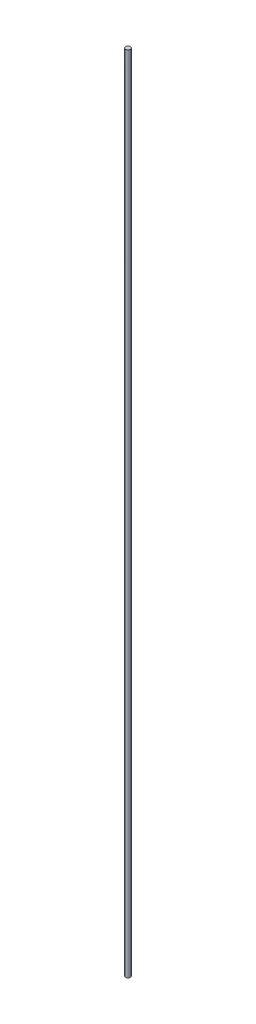
ISO-10303-21;
HEADER;
FILE_DESCRIPTION(('STEP AP214'),'2;1');
FILE_NAME('part.step','',(''),(''),'','','');
FILE_SCHEMA(('AUTOMOTIVE_DESIGN { 1 0 10303 214 1 1 1 1 }'));
ENDSEC;
DATA;
#1=APPLICATION_CONTEXT('core data for automotive mechanical design processes');
#2=APPLICATION_PROTOCOL_DEFINITION('international standard','automotive_design',2000,#1);
#3=PRODUCT_CONTEXT('',#1,'mechanical');
#4=PRODUCT('Part','Part','',(#3));
#5=PRODUCT_RELATED_PRODUCT_CATEGORY('part','',(#4));
#6=PRODUCT_DEFINITION_FORMATION('','',#4);
#7=PRODUCT_DEFINITION_CONTEXT('part definition',#1,'design');
#8=PRODUCT_DEFINITION('design','',#6,#7);
#9=PRODUCT_DEFINITION_SHAPE('','',#8);
#10=(LENGTH_UNIT() NAMED_UNIT(*) SI_UNIT(.MILLI.,.METRE.));
#11=(NAMED_UNIT(*) PLANE_ANGLE_UNIT() SI_UNIT($,.RADIAN.));
#12=(NAMED_UNIT(*) SI_UNIT($,.STERADIAN.) SOLID_ANGLE_UNIT());
#13=UNCERTAINTY_MEASURE_WITH_UNIT(LENGTH_MEASURE(1.E-05),#10,'distance_accuracy_value','');
#14=(GEOMETRIC_REPRESENTATION_CONTEXT(3) GLOBAL_UNCERTAINTY_ASSIGNED_CONTEXT((#13)) GLOBAL_UNIT_ASSIGNED_CONTEXT((#10,
#11,#12)) REPRESENTATION_CONTEXT('',''));
#15=CARTESIAN_POINT('',(0.,0.,0.));
#16=DIRECTION('',(0.,0.,1.));
#17=DIRECTION('',(1.,0.,0.));
#18=AXIS2_PLACEMENT_3D('',#15,#16,#17);
#19=CARTESIAN_POINT('',(0.,-47.8811269837221,0.));
#20=DIRECTION('',(0.,1.,0.));
#21=DIRECTION('',(0.,0.,-1.));
#22=AXIS2_PLACEMENT_3D('',#19,#20,#21);
#23=CYLINDRICAL_SURFACE('',#22,0.109999999999999);
#24=CARTESIAN_POINT('',(0.,-37.57,0.));
#25=DIRECTION('',(0.,-1.,0.));
#26=DIRECTION('',(-1.,0.,0.));
#27=AXIS2_PLACEMENT_3D('',#24,#25,#26);
#28=CIRCLE('',#27,0.109999999999999);
#29=CARTESIAN_POINT('',(-0.109999999999999,-37.57,0.));
#30=VERTEX_POINT('',#29);
#31=EDGE_CURVE('E10',#30,#30,#28,.F.);
#32=ORIENTED_EDGE('',*,*,#31,.T.);
#33=EDGE_LOOP('',(#32));
#34=FACE_BOUND('',#33,.T.);
#35=CARTESIAN_POINT('',(0.,0.,0.));
#36=DIRECTION('',(0.,-1.,0.));
#37=DIRECTION('',(0.,0.,-1.));
#38=AXIS2_PLACEMENT_3D('',#35,#36,#37);
#39=CIRCLE('',#38,0.109999999999999);
#40=CARTESIAN_POINT('',(0.,0.,-0.109999999999999));
#41=VERTEX_POINT('',#40);
#42=EDGE_CURVE('E41',#41,#41,#39,.T.);
#43=ORIENTED_EDGE('',*,*,#42,.T.);
#44=EDGE_LOOP('',(#43));
#45=FACE_BOUND('',#44,.T.);
#46=ADVANCED_FACE('F35',(#34,#45),#23,.T.);
#47=CARTESIAN_POINT('',(0.,0.,0.));
#48=DIRECTION('',(0.,1.,0.));
#49=DIRECTION('',(0.,0.,-1.));
#50=AXIS2_PLACEMENT_3D('',#47,#48,#49);
#51=PLANE('',#50);
#52=ORIENTED_EDGE('',*,*,#42,.F.);
#53=EDGE_LOOP('',(#52));
#54=FACE_BOUND('',#53,.T.);
#55=ADVANCED_FACE('F48',(#54),#51,.T.);
#56=CARTESIAN_POINT('',(0.,-37.57,0.));
#57=DIRECTION('',(0.,1.,0.));
#58=DIRECTION('',(0.961490609092656,0.,-0.274837786024107));
#59=AXIS2_PLACEMENT_3D('',#56,#57,#58);
#60=PLANE('',#59);
#61=ORIENTED_EDGE('',*,*,#31,.F.);
#62=EDGE_LOOP('',(#61));
#63=FACE_BOUND('',#62,.T.);
#64=ADVANCED_FACE('F50',(#63),#60,.F.);
#65=CLOSED_SHELL('',(#46,#55,#64));
#66=MANIFOLD_SOLID_BREP('B2',#65);
#67=ADVANCED_BREP_SHAPE_REPRESENTATION('',(#18,#66),#14);
#68=SHAPE_DEFINITION_REPRESENTATION(#9,#67);
ENDSEC;
END-ISO-10303-21;
